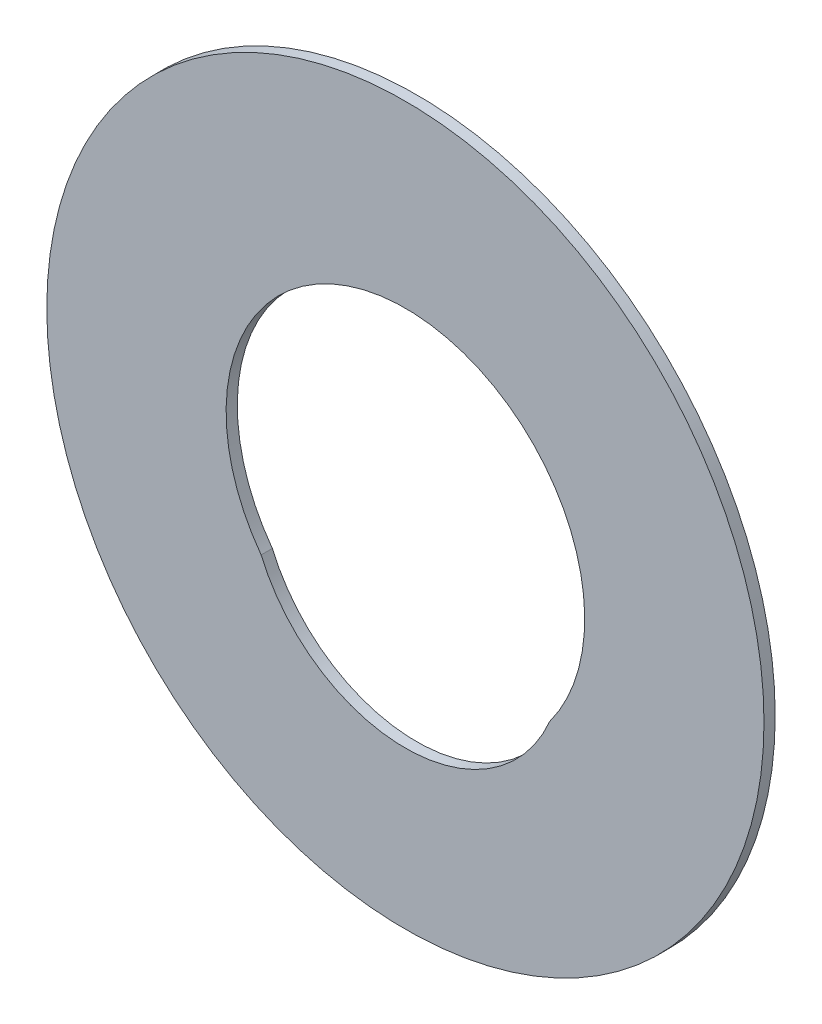
ISO-10303-21;
HEADER;
FILE_DESCRIPTION(('STEP AP214'),'2;1');
FILE_NAME('part.step','',(''),(''),'','','');
FILE_SCHEMA(('AUTOMOTIVE_DESIGN { 1 0 10303 214 1 1 1 1 }'));
ENDSEC;
DATA;
#1=APPLICATION_CONTEXT('core data for automotive mechanical design processes');
#2=APPLICATION_PROTOCOL_DEFINITION('international standard','automotive_design',2000,#1);
#3=PRODUCT_CONTEXT('',#1,'mechanical');
#4=PRODUCT('Part','Part','',(#3));
#5=PRODUCT_RELATED_PRODUCT_CATEGORY('part','',(#4));
#6=PRODUCT_DEFINITION_FORMATION('','',#4);
#7=PRODUCT_DEFINITION_CONTEXT('part definition',#1,'design');
#8=PRODUCT_DEFINITION('design','',#6,#7);
#9=PRODUCT_DEFINITION_SHAPE('','',#8);
#10=(LENGTH_UNIT() NAMED_UNIT(*) SI_UNIT(.MILLI.,.METRE.));
#11=(NAMED_UNIT(*) PLANE_ANGLE_UNIT() SI_UNIT($,.RADIAN.));
#12=(NAMED_UNIT(*) SI_UNIT($,.STERADIAN.) SOLID_ANGLE_UNIT());
#13=UNCERTAINTY_MEASURE_WITH_UNIT(LENGTH_MEASURE(1.E-05),#10,'distance_accuracy_value','');
#14=(GEOMETRIC_REPRESENTATION_CONTEXT(3) GLOBAL_UNCERTAINTY_ASSIGNED_CONTEXT((#13)) GLOBAL_UNIT_ASSIGNED_CONTEXT((#10,
#11,#12)) REPRESENTATION_CONTEXT('',''));
#15=CARTESIAN_POINT('',(0.,0.,0.));
#16=DIRECTION('',(0.,0.,1.));
#17=DIRECTION('',(1.,0.,0.));
#18=AXIS2_PLACEMENT_3D('',#15,#16,#17);
#19=CARTESIAN_POINT('',(0.,0.,0.));
#20=DIRECTION('',(0.,0.,1.));
#21=DIRECTION('',(1.,0.,0.));
#22=AXIS2_PLACEMENT_3D('',#19,#20,#21);
#23=PLANE('',#22);
#24=CARTESIAN_POINT('',(0.,0.,0.));
#25=DIRECTION('',(0.,0.,-1.));
#26=DIRECTION('',(-1.,0.,0.));
#27=AXIS2_PLACEMENT_3D('',#24,#25,#26);
#28=CIRCLE('',#27,4.);
#29=CARTESIAN_POINT('',(3.21859829739593,-2.375,0.));
#30=VERTEX_POINT('',#29);
#31=CARTESIAN_POINT('',(-3.21859829739593,-2.375,0.));
#32=VERTEX_POINT('',#31);
#33=EDGE_CURVE('E45',#30,#32,#28,.F.);
#34=ORIENTED_EDGE('',*,*,#33,.T.);
#35=CARTESIAN_POINT('',(0.,-1.,0.));
#36=DIRECTION('',(0.,0.,1.));
#37=DIRECTION('',(1.,0.,0.));
#38=AXIS2_PLACEMENT_3D('',#35,#36,#37);
#39=CIRCLE('',#38,3.5);
#40=EDGE_CURVE('E21',#32,#30,#39,.T.);
#41=ORIENTED_EDGE('',*,*,#40,.T.);
#42=EDGE_LOOP('',(#34,#41));
#43=FACE_BOUND('',#42,.T.);
#44=CARTESIAN_POINT('',(0.,0.,0.));
#45=DIRECTION('',(0.,0.,-1.));
#46=DIRECTION('',(-1.,0.,0.));
#47=AXIS2_PLACEMENT_3D('',#44,#45,#46);
#48=CIRCLE('',#47,8.);
#49=CARTESIAN_POINT('',(-8.,0.,0.));
#50=VERTEX_POINT('',#49);
#51=EDGE_CURVE('E56',#50,#50,#48,.F.);
#52=ORIENTED_EDGE('',*,*,#51,.F.);
#53=EDGE_LOOP('',(#52));
#54=FACE_BOUND('',#53,.T.);
#55=ADVANCED_FACE('F18',(#43,#54),#23,.F.);
#56=CARTESIAN_POINT('',(0.,-1.,0.));
#57=DIRECTION('',(0.,0.,1.));
#58=DIRECTION('',(1.,0.,0.));
#59=AXIS2_PLACEMENT_3D('',#56,#57,#58);
#60=CYLINDRICAL_SURFACE('',#59,3.5);
#61=CARTESIAN_POINT('',(0.,-1.,0.25));
#62=DIRECTION('',(0.,0.,1.));
#63=DIRECTION('',(1.,0.,0.));
#64=AXIS2_PLACEMENT_3D('',#61,#62,#63);
#65=CIRCLE('',#64,3.5);
#66=CARTESIAN_POINT('',(3.21859829739593,-2.375,0.25));
#67=VERTEX_POINT('',#66);
#68=CARTESIAN_POINT('',(-3.21859829739593,-2.375,0.25));
#69=VERTEX_POINT('',#68);
#70=EDGE_CURVE('E52',#67,#69,#65,.F.);
#71=ORIENTED_EDGE('',*,*,#70,.F.);
#72=DIRECTION('',(0.,0.,-1.));
#73=VECTOR('',#72,1.);
#74=CARTESIAN_POINT('',(3.21859829739593,-2.375,0.25));
#75=LINE('',#74,#73);
#76=EDGE_CURVE('E49',#67,#30,#75,.T.);
#77=ORIENTED_EDGE('',*,*,#76,.T.);
#78=ORIENTED_EDGE('',*,*,#40,.F.);
#79=DIRECTION('',(0.,0.,-1.));
#80=VECTOR('',#79,1.);
#81=CARTESIAN_POINT('',(-3.21859829739593,-2.375,0.25));
#82=LINE('',#81,#80);
#83=EDGE_CURVE('E36',#32,#69,#82,.F.);
#84=ORIENTED_EDGE('',*,*,#83,.T.);
#85=EDGE_LOOP('',(#71,#77,#78,#84));
#86=FACE_BOUND('',#85,.T.);
#87=ADVANCED_FACE('F50',(#86),#60,.F.);
#88=CARTESIAN_POINT('',(0.,0.,0.25));
#89=DIRECTION('',(0.,0.,-1.));
#90=DIRECTION('',(-1.,0.,0.));
#91=AXIS2_PLACEMENT_3D('',#88,#89,#90);
#92=CYLINDRICAL_SURFACE('',#91,4.);
#93=ORIENTED_EDGE('',*,*,#76,.F.);
#94=CARTESIAN_POINT('',(0.,0.,0.25));
#95=DIRECTION('',(0.,0.,-1.));
#96=DIRECTION('',(-1.,0.,0.));
#97=AXIS2_PLACEMENT_3D('',#94,#95,#96);
#98=CIRCLE('',#97,4.);
#99=EDGE_CURVE('E27',#69,#67,#98,.T.);
#100=ORIENTED_EDGE('',*,*,#99,.F.);
#101=ORIENTED_EDGE('',*,*,#83,.F.);
#102=ORIENTED_EDGE('',*,*,#33,.F.);
#103=EDGE_LOOP('',(#93,#100,#101,#102));
#104=FACE_BOUND('',#103,.T.);
#105=ADVANCED_FACE('F55',(#104),#92,.F.);
#106=CARTESIAN_POINT('',(0.,0.,0.25));
#107=DIRECTION('',(0.,0.,-1.));
#108=DIRECTION('',(-1.,0.,0.));
#109=AXIS2_PLACEMENT_3D('',#106,#107,#108);
#110=CYLINDRICAL_SURFACE('',#109,8.);
#111=ORIENTED_EDGE('',*,*,#51,.T.);
#112=EDGE_LOOP('',(#111));
#113=FACE_BOUND('',#112,.T.);
#114=CARTESIAN_POINT('',(0.,0.,0.25));
#115=DIRECTION('',(0.,0.,-1.));
#116=DIRECTION('',(-1.,0.,0.));
#117=AXIS2_PLACEMENT_3D('',#114,#115,#116);
#118=CIRCLE('',#117,8.);
#119=CARTESIAN_POINT('',(-8.,0.,0.25));
#120=VERTEX_POINT('',#119);
#121=EDGE_CURVE('E11',#120,#120,#118,.F.);
#122=ORIENTED_EDGE('',*,*,#121,.F.);
#123=EDGE_LOOP('',(#122));
#124=FACE_BOUND('',#123,.T.);
#125=ADVANCED_FACE('F65',(#113,#124),#110,.T.);
#126=CARTESIAN_POINT('',(0.,0.,0.25));
#127=DIRECTION('',(0.,0.,1.));
#128=DIRECTION('',(1.,0.,0.));
#129=AXIS2_PLACEMENT_3D('',#126,#127,#128);
#130=PLANE('',#129);
#131=ORIENTED_EDGE('',*,*,#121,.T.);
#132=EDGE_LOOP('',(#131));
#133=FACE_BOUND('',#132,.T.);
#134=ORIENTED_EDGE('',*,*,#99,.T.);
#135=ORIENTED_EDGE('',*,*,#70,.T.);
#136=EDGE_LOOP('',(#134,#135));
#137=FACE_BOUND('',#136,.T.);
#138=ADVANCED_FACE('F63',(#133,#137),#130,.T.);
#139=CLOSED_SHELL('',(#55,#87,#105,#125,#138));
#140=MANIFOLD_SOLID_BREP('B1',#139);
#141=ADVANCED_BREP_SHAPE_REPRESENTATION('',(#18,#140),#14);
#142=SHAPE_DEFINITION_REPRESENTATION(#9,#141);
ENDSEC;
END-ISO-10303-21;
